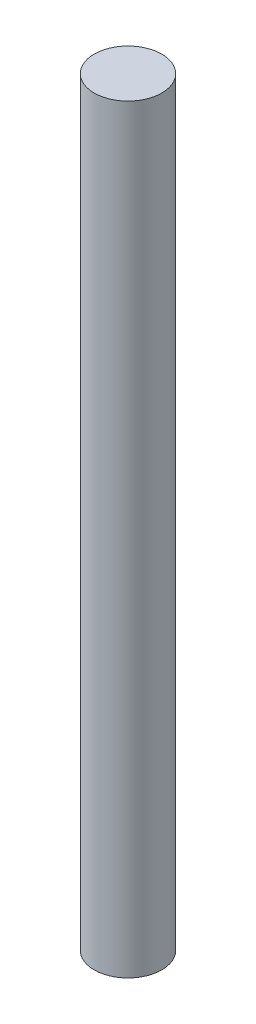
ISO-10303-21;
HEADER;
FILE_DESCRIPTION(('STEP AP214'),'2;1');
FILE_NAME('part.step','',(''),(''),'','','');
FILE_SCHEMA(('AUTOMOTIVE_DESIGN { 1 0 10303 214 1 1 1 1 }'));
ENDSEC;
DATA;
#1=APPLICATION_CONTEXT('core data for automotive mechanical design processes');
#2=APPLICATION_PROTOCOL_DEFINITION('international standard','automotive_design',2000,#1);
#3=PRODUCT_CONTEXT('',#1,'mechanical');
#4=PRODUCT('Part','Part','',(#3));
#5=PRODUCT_RELATED_PRODUCT_CATEGORY('part','',(#4));
#6=PRODUCT_DEFINITION_FORMATION('','',#4);
#7=PRODUCT_DEFINITION_CONTEXT('part definition',#1,'design');
#8=PRODUCT_DEFINITION('design','',#6,#7);
#9=PRODUCT_DEFINITION_SHAPE('','',#8);
#10=(LENGTH_UNIT() NAMED_UNIT(*) SI_UNIT(.MILLI.,.METRE.));
#11=(NAMED_UNIT(*) PLANE_ANGLE_UNIT() SI_UNIT($,.RADIAN.));
#12=(NAMED_UNIT(*) SI_UNIT($,.STERADIAN.) SOLID_ANGLE_UNIT());
#13=UNCERTAINTY_MEASURE_WITH_UNIT(LENGTH_MEASURE(1.E-05),#10,'distance_accuracy_value','');
#14=(GEOMETRIC_REPRESENTATION_CONTEXT(3) GLOBAL_UNCERTAINTY_ASSIGNED_CONTEXT((#13)) GLOBAL_UNIT_ASSIGNED_CONTEXT((#10,
#11,#12)) REPRESENTATION_CONTEXT('',''));
#15=CARTESIAN_POINT('',(0.,0.,0.));
#16=DIRECTION('',(0.,0.,1.));
#17=DIRECTION('',(1.,0.,0.));
#18=AXIS2_PLACEMENT_3D('',#15,#16,#17);
#19=CARTESIAN_POINT('',(0.,450.,0.));
#20=DIRECTION('',(0.,-1.,0.));
#21=DIRECTION('',(0.,0.,-1.));
#22=AXIS2_PLACEMENT_3D('',#19,#20,#21);
#23=CYLINDRICAL_SURFACE('',#22,40.);
#24=CARTESIAN_POINT('',(0.,450.,0.));
#25=DIRECTION('',(0.,1.,0.));
#26=DIRECTION('',(0.,0.,1.));
#27=AXIS2_PLACEMENT_3D('',#24,#25,#26);
#28=CIRCLE('',#27,40.);
#29=CARTESIAN_POINT('',(0.,450.,40.));
#30=VERTEX_POINT('',#29);
#31=EDGE_CURVE('E10',#30,#30,#28,.T.);
#32=ORIENTED_EDGE('',*,*,#31,.F.);
#33=EDGE_LOOP('',(#32));
#34=FACE_BOUND('',#33,.T.);
#35=CARTESIAN_POINT('',(0.,-450.,0.));
#36=DIRECTION('',(0.,1.,0.));
#37=DIRECTION('',(0.,0.,1.));
#38=AXIS2_PLACEMENT_3D('',#35,#36,#37);
#39=CIRCLE('',#38,40.);
#40=CARTESIAN_POINT('',(0.,-450.,40.));
#41=VERTEX_POINT('',#40);
#42=EDGE_CURVE('E38',#41,#41,#39,.T.);
#43=ORIENTED_EDGE('',*,*,#42,.T.);
#44=EDGE_LOOP('',(#43));
#45=FACE_BOUND('',#44,.T.);
#46=ADVANCED_FACE('F35',(#34,#45),#23,.T.);
#47=CARTESIAN_POINT('',(0.,450.,0.));
#48=DIRECTION('',(0.,1.,0.));
#49=DIRECTION('',(0.,0.,1.));
#50=AXIS2_PLACEMENT_3D('',#47,#48,#49);
#51=PLANE('',#50);
#52=ORIENTED_EDGE('',*,*,#31,.T.);
#53=EDGE_LOOP('',(#52));
#54=FACE_BOUND('',#53,.T.);
#55=ADVANCED_FACE('F50',(#54),#51,.T.);
#56=CARTESIAN_POINT('',(0.,-450.,0.));
#57=DIRECTION('',(0.,1.,0.));
#58=DIRECTION('',(0.,0.,1.));
#59=AXIS2_PLACEMENT_3D('',#56,#57,#58);
#60=PLANE('',#59);
#61=ORIENTED_EDGE('',*,*,#42,.F.);
#62=EDGE_LOOP('',(#61));
#63=FACE_BOUND('',#62,.T.);
#64=ADVANCED_FACE('F48',(#63),#60,.F.);
#65=CLOSED_SHELL('',(#46,#55,#64));
#66=MANIFOLD_SOLID_BREP('B2',#65);
#67=ADVANCED_BREP_SHAPE_REPRESENTATION('',(#18,#66),#14);
#68=SHAPE_DEFINITION_REPRESENTATION(#9,#67);
ENDSEC;
END-ISO-10303-21;
